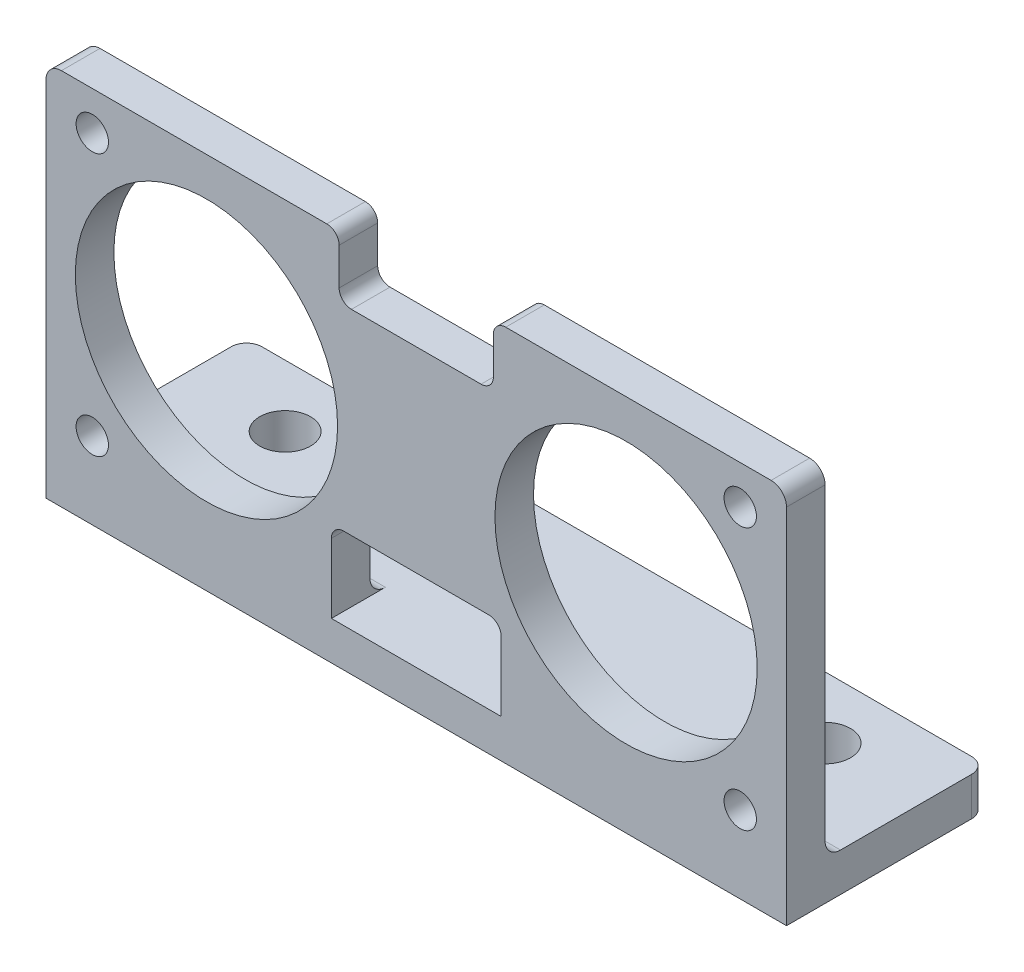
ISO-10303-21;
HEADER;
FILE_DESCRIPTION(('STEP AP214'),'2;1');
FILE_NAME('part.step','',(''),(''),'','','');
FILE_SCHEMA(('AUTOMOTIVE_DESIGN { 1 0 10303 214 1 1 1 1 }'));
ENDSEC;
DATA;
#1=APPLICATION_CONTEXT('core data for automotive mechanical design processes');
#2=APPLICATION_PROTOCOL_DEFINITION('international standard','automotive_design',2000,#1);
#3=PRODUCT_CONTEXT('',#1,'mechanical');
#4=PRODUCT('Part','Part','',(#3));
#5=PRODUCT_RELATED_PRODUCT_CATEGORY('part','',(#4));
#6=PRODUCT_DEFINITION_FORMATION('','',#4);
#7=PRODUCT_DEFINITION_CONTEXT('part definition',#1,'design');
#8=PRODUCT_DEFINITION('design','',#6,#7);
#9=PRODUCT_DEFINITION_SHAPE('','',#8);
#10=(LENGTH_UNIT() NAMED_UNIT(*) SI_UNIT(.MILLI.,.METRE.));
#11=(NAMED_UNIT(*) PLANE_ANGLE_UNIT() SI_UNIT($,.RADIAN.));
#12=(NAMED_UNIT(*) SI_UNIT($,.STERADIAN.) SOLID_ANGLE_UNIT());
#13=UNCERTAINTY_MEASURE_WITH_UNIT(LENGTH_MEASURE(1.E-05),#10,'distance_accuracy_value','');
#14=(GEOMETRIC_REPRESENTATION_CONTEXT(3) GLOBAL_UNCERTAINTY_ASSIGNED_CONTEXT((#13)) GLOBAL_UNIT_ASSIGNED_CONTEXT((#10,
#11,#12)) REPRESENTATION_CONTEXT('',''));
#15=CARTESIAN_POINT('',(0.,0.,0.));
#16=DIRECTION('',(0.,0.,1.));
#17=DIRECTION('',(1.,0.,0.));
#18=AXIS2_PLACEMENT_3D('',#15,#16,#17);
#19=CARTESIAN_POINT('',(5.,0.,2.5));
#20=DIRECTION('',(-1.,0.,0.));
#21=DIRECTION('',(0.,0.,1.));
#22=AXIS2_PLACEMENT_3D('',#19,#20,#21);
#23=PLANE('',#22);
#24=DIRECTION('',(0.,1.,0.));
#25=VECTOR('',#24,1.);
#26=CARTESIAN_POINT('',(5.,0.,2.5));
#27=LINE('',#26,#25);
#28=CARTESIAN_POINT('',(5.,7.8,2.5));
#29=VERTEX_POINT('',#28);
#30=CARTESIAN_POINT('',(5.,10.2,2.5));
#31=VERTEX_POINT('',#30);
#32=EDGE_CURVE('E285',#29,#31,#27,.T.);
#33=ORIENTED_EDGE('',*,*,#32,.T.);
#34=DIRECTION('',(0.,0.,-1.));
#35=VECTOR('',#34,1.);
#36=CARTESIAN_POINT('',(5.,10.2,2.5));
#37=LINE('',#36,#35);
#38=CARTESIAN_POINT('',(5.,10.2,0.));
#39=VERTEX_POINT('',#38);
#40=EDGE_CURVE('E364',#31,#39,#37,.T.);
#41=ORIENTED_EDGE('',*,*,#40,.T.);
#42=DIRECTION('',(0.,1.,0.));
#43=VECTOR('',#42,1.);
#44=CARTESIAN_POINT('',(5.,0.,0.));
#45=LINE('',#44,#43);
#46=CARTESIAN_POINT('',(5.,7.8,0.));
#47=VERTEX_POINT('',#46);
#48=EDGE_CURVE('E317',#47,#39,#45,.T.);
#49=ORIENTED_EDGE('',*,*,#48,.F.);
#50=DIRECTION('',(0.,0.,-1.));
#51=VECTOR('',#50,1.);
#52=CARTESIAN_POINT('',(5.,7.8,2.5));
#53=LINE('',#52,#51);
#54=EDGE_CURVE('E362',#47,#29,#53,.F.);
#55=ORIENTED_EDGE('',*,*,#54,.T.);
#56=EDGE_LOOP('',(#33,#41,#49,#55));
#57=FACE_BOUND('',#56,.T.);
#58=ADVANCED_FACE('F45',(#57),#23,.T.);
#59=CARTESIAN_POINT('',(0.,7.,2.5));
#60=DIRECTION('',(0.,1.,0.));
#61=DIRECTION('',(0.,0.,1.));
#62=AXIS2_PLACEMENT_3D('',#59,#60,#61);
#63=PLANE('',#62);
#64=DIRECTION('',(1.,0.,0.));
#65=VECTOR('',#64,1.);
#66=CARTESIAN_POINT('',(0.,7.,2.5));
#67=LINE('',#66,#65);
#68=CARTESIAN_POINT('',(-4.2,7.,2.5));
#69=VERTEX_POINT('',#68);
#70=CARTESIAN_POINT('',(4.2,7.,2.5));
#71=VERTEX_POINT('',#70);
#72=EDGE_CURVE('E288',#69,#71,#67,.T.);
#73=ORIENTED_EDGE('',*,*,#72,.T.);
#74=DIRECTION('',(0.,0.,-1.));
#75=VECTOR('',#74,1.);
#76=CARTESIAN_POINT('',(4.2,7.,0.));
#77=LINE('',#76,#75);
#78=CARTESIAN_POINT('',(4.2,7.,0.));
#79=VERTEX_POINT('',#78);
#80=EDGE_CURVE('E371',#71,#79,#77,.T.);
#81=ORIENTED_EDGE('',*,*,#80,.T.);
#82=DIRECTION('',(1.,0.,0.));
#83=VECTOR('',#82,1.);
#84=CARTESIAN_POINT('',(0.,7.,0.));
#85=LINE('',#84,#83);
#86=CARTESIAN_POINT('',(-4.2,7.,0.));
#87=VERTEX_POINT('',#86);
#88=EDGE_CURVE('E320',#87,#79,#85,.T.);
#89=ORIENTED_EDGE('',*,*,#88,.F.);
#90=DIRECTION('',(0.,0.,-1.));
#91=VECTOR('',#90,1.);
#92=CARTESIAN_POINT('',(-4.2,7.,2.5));
#93=LINE('',#92,#91);
#94=EDGE_CURVE('E369',#87,#69,#93,.F.);
#95=ORIENTED_EDGE('',*,*,#94,.T.);
#96=EDGE_LOOP('',(#73,#81,#89,#95));
#97=FACE_BOUND('',#96,.T.);
#98=ADVANCED_FACE('F545',(#97),#63,.T.);
#99=CARTESIAN_POINT('',(-5.,0.,2.5));
#100=DIRECTION('',(-1.,0.,0.));
#101=DIRECTION('',(0.,0.,1.));
#102=AXIS2_PLACEMENT_3D('',#99,#100,#101);
#103=PLANE('',#102);
#104=DIRECTION('',(0.,1.,0.));
#105=VECTOR('',#104,1.);
#106=CARTESIAN_POINT('',(-5.,0.,0.));
#107=LINE('',#106,#105);
#108=CARTESIAN_POINT('',(-5.,7.8,0.));
#109=VERTEX_POINT('',#108);
#110=CARTESIAN_POINT('',(-5.,10.2,0.));
#111=VERTEX_POINT('',#110);
#112=EDGE_CURVE('E323',#109,#111,#107,.T.);
#113=ORIENTED_EDGE('',*,*,#112,.T.);
#114=DIRECTION('',(0.,0.,-1.));
#115=VECTOR('',#114,1.);
#116=CARTESIAN_POINT('',(-5.,10.2,2.5));
#117=LINE('',#116,#115);
#118=CARTESIAN_POINT('',(-5.,10.2,2.5));
#119=VERTEX_POINT('',#118);
#120=EDGE_CURVE('E355',#111,#119,#117,.F.);
#121=ORIENTED_EDGE('',*,*,#120,.T.);
#122=DIRECTION('',(0.,1.,0.));
#123=VECTOR('',#122,1.);
#124=CARTESIAN_POINT('',(-5.,0.,2.5));
#125=LINE('',#124,#123);
#126=CARTESIAN_POINT('',(-5.,7.8,2.5));
#127=VERTEX_POINT('',#126);
#128=EDGE_CURVE('E291',#127,#119,#125,.T.);
#129=ORIENTED_EDGE('',*,*,#128,.F.);
#130=DIRECTION('',(0.,0.,-1.));
#131=VECTOR('',#130,1.);
#132=CARTESIAN_POINT('',(-5.,7.8,2.5));
#133=LINE('',#132,#131);
#134=EDGE_CURVE('E352',#127,#109,#133,.T.);
#135=ORIENTED_EDGE('',*,*,#134,.T.);
#136=EDGE_LOOP('',(#113,#121,#129,#135));
#137=FACE_BOUND('',#136,.T.);
#138=ADVANCED_FACE('F551',(#137),#103,.F.);
#139=CARTESIAN_POINT('',(0.,11.,2.5));
#140=DIRECTION('',(0.,1.,0.));
#141=DIRECTION('',(0.,0.,1.));
#142=AXIS2_PLACEMENT_3D('',#139,#140,#141);
#143=PLANE('',#142);
#144=DIRECTION('',(1.,0.,0.));
#145=VECTOR('',#144,1.);
#146=CARTESIAN_POINT('',(0.,11.,0.));
#147=LINE('',#146,#145);
#148=CARTESIAN_POINT('',(-23.,11.,0.));
#149=VERTEX_POINT('',#148);
#150=CARTESIAN_POINT('',(-5.8,11.,0.));
#151=VERTEX_POINT('',#150);
#152=EDGE_CURVE('E326',#149,#151,#147,.T.);
#153=ORIENTED_EDGE('',*,*,#152,.F.);
#154=DIRECTION('',(0.,0.,-1.));
#155=VECTOR('',#154,1.);
#156=CARTESIAN_POINT('',(-23.,11.,2.5));
#157=LINE('',#156,#155);
#158=CARTESIAN_POINT('',(-23.,11.,2.5));
#159=VERTEX_POINT('',#158);
#160=EDGE_CURVE('E11',#149,#159,#157,.F.);
#161=ORIENTED_EDGE('',*,*,#160,.T.);
#162=DIRECTION('',(1.,0.,0.));
#163=VECTOR('',#162,1.);
#164=CARTESIAN_POINT('',(0.,11.,2.5));
#165=LINE('',#164,#163);
#166=CARTESIAN_POINT('',(-5.8,11.,2.5));
#167=VERTEX_POINT('',#166);
#168=EDGE_CURVE('E294',#159,#167,#165,.T.);
#169=ORIENTED_EDGE('',*,*,#168,.T.);
#170=DIRECTION('',(0.,0.,-1.));
#171=VECTOR('',#170,1.);
#172=CARTESIAN_POINT('',(-5.8,11.,0.));
#173=LINE('',#172,#171);
#174=EDGE_CURVE('E345',#167,#151,#173,.T.);
#175=ORIENTED_EDGE('',*,*,#174,.T.);
#176=EDGE_LOOP('',(#153,#161,#169,#175));
#177=FACE_BOUND('',#176,.T.);
#178=ADVANCED_FACE('F620',(#177),#143,.T.);
#179=CARTESIAN_POINT('',(-24.,0.,2.5));
#180=DIRECTION('',(-1.,0.,0.));
#181=DIRECTION('',(0.,0.,1.));
#182=AXIS2_PLACEMENT_3D('',#179,#180,#181);
#183=PLANE('',#182);
#184=DIRECTION('',(0.,0.,-1.));
#185=VECTOR('',#184,1.);
#186=CARTESIAN_POINT('',(-24.,-11.,2.5));
#187=LINE('',#186,#185);
#188=CARTESIAN_POINT('',(-24.,-11.,-0.999999999999999));
#189=VERTEX_POINT('',#188);
#190=CARTESIAN_POINT('',(-24.,-11.,-9.49999999999999));
#191=VERTEX_POINT('',#190);
#192=EDGE_CURVE('E253',#189,#191,#187,.T.);
#193=ORIENTED_EDGE('',*,*,#192,.T.);
#194=DIRECTION('',(0.,1.,0.));
#195=VECTOR('',#194,1.);
#196=CARTESIAN_POINT('',(-24.,-13.5,-9.5));
#197=LINE('',#196,#195);
#198=CARTESIAN_POINT('',(-24.,-13.5,-9.49999999999999));
#199=VERTEX_POINT('',#198);
#200=EDGE_CURVE('E437',#191,#199,#197,.F.);
#201=ORIENTED_EDGE('',*,*,#200,.T.);
#202=DIRECTION('',(0.,0.,-1.));
#203=VECTOR('',#202,1.);
#204=CARTESIAN_POINT('',(-24.,-13.5,2.5));
#205=LINE('',#204,#203);
#206=CARTESIAN_POINT('',(-24.,-13.5,2.5));
#207=VERTEX_POINT('',#206);
#208=EDGE_CURVE('E265',#207,#199,#205,.T.);
#209=ORIENTED_EDGE('',*,*,#208,.F.);
#210=DIRECTION('',(0.,1.,0.));
#211=VECTOR('',#210,1.);
#212=CARTESIAN_POINT('',(-24.,0.,2.5));
#213=LINE('',#212,#211);
#214=CARTESIAN_POINT('',(-24.,9.99999999999999,2.5));
#215=VERTEX_POINT('',#214);
#216=EDGE_CURVE('E245',#207,#215,#213,.T.);
#217=ORIENTED_EDGE('',*,*,#216,.T.);
#218=DIRECTION('',(0.,0.,-1.));
#219=VECTOR('',#218,1.);
#220=CARTESIAN_POINT('',(-24.,9.99999999999999,2.5));
#221=LINE('',#220,#219);
#222=CARTESIAN_POINT('',(-24.,9.99999999999999,0.));
#223=VERTEX_POINT('',#222);
#224=EDGE_CURVE('E434',#215,#223,#221,.T.);
#225=ORIENTED_EDGE('',*,*,#224,.T.);
#226=DIRECTION('',(0.,1.,0.));
#227=VECTOR('',#226,1.);
#228=CARTESIAN_POINT('',(-24.,0.,0.));
#229=LINE('',#228,#227);
#230=CARTESIAN_POINT('',(-24.,-10.,0.));
#231=VERTEX_POINT('',#230);
#232=EDGE_CURVE('E328',#231,#223,#229,.T.);
#233=ORIENTED_EDGE('',*,*,#232,.F.);
#234=CARTESIAN_POINT('',(-24.,-10.,-1.));
#235=DIRECTION('',(-1.,0.,0.));
#236=DIRECTION('',(0.,0.,1.));
#237=AXIS2_PLACEMENT_3D('',#234,#235,#236);
#238=CIRCLE('',#237,1.);
#239=EDGE_CURVE('E412',#231,#189,#238,.F.);
#240=ORIENTED_EDGE('',*,*,#239,.T.);
#241=EDGE_LOOP('',(#193,#201,#209,#217,#225,#233,#240));
#242=FACE_BOUND('',#241,.T.);
#243=ADVANCED_FACE('F506',(#242),#183,.T.);
#244=CARTESIAN_POINT('',(-5.5,0.,2.5));
#245=DIRECTION('',(1.,0.,0.));
#246=DIRECTION('',(0.,1.,0.));
#247=AXIS2_PLACEMENT_3D('',#244,#245,#246);
#248=PLANE('',#247);
#249=DIRECTION('',(0.,-1.,0.));
#250=VECTOR('',#249,1.);
#251=CARTESIAN_POINT('',(-5.5,0.,0.));
#252=LINE('',#251,#250);
#253=CARTESIAN_POINT('',(-5.5,-6.5,0.));
#254=VERTEX_POINT('',#253);
#255=CARTESIAN_POINT('',(-5.5,-10.,0.));
#256=VERTEX_POINT('',#255);
#257=EDGE_CURVE('E330',#254,#256,#252,.T.);
#258=ORIENTED_EDGE('',*,*,#257,.F.);
#259=DIRECTION('',(0.,0.,-1.));
#260=VECTOR('',#259,1.);
#261=CARTESIAN_POINT('',(-5.5,-6.5,2.5));
#262=LINE('',#261,#260);
#263=CARTESIAN_POINT('',(-5.5,-6.5,2.5));
#264=VERTEX_POINT('',#263);
#265=EDGE_CURVE('E379',#254,#264,#262,.F.);
#266=ORIENTED_EDGE('',*,*,#265,.T.);
#267=DIRECTION('',(0.,-1.,0.));
#268=VECTOR('',#267,1.);
#269=CARTESIAN_POINT('',(-5.5,0.,2.5));
#270=LINE('',#269,#268);
#271=CARTESIAN_POINT('',(-5.5,-11.,2.5));
#272=VERTEX_POINT('',#271);
#273=EDGE_CURVE('E297',#264,#272,#270,.T.);
#274=ORIENTED_EDGE('',*,*,#273,.T.);
#275=DIRECTION('',(0.,0.,-1.));
#276=VECTOR('',#275,1.);
#277=CARTESIAN_POINT('',(-5.5,-11.,2.5));
#278=LINE('',#277,#276);
#279=CARTESIAN_POINT('',(-5.5,-11.,-1.));
#280=VERTEX_POINT('',#279);
#281=EDGE_CURVE('E343',#272,#280,#278,.T.);
#282=ORIENTED_EDGE('',*,*,#281,.T.);
#283=CARTESIAN_POINT('',(-5.5,-10.,-1.));
#284=DIRECTION('',(1.,0.,0.));
#285=DIRECTION('',(0.,1.,0.));
#286=AXIS2_PLACEMENT_3D('',#283,#284,#285);
#287=CIRCLE('',#286,1.);
#288=EDGE_CURVE('E410',#280,#256,#287,.F.);
#289=ORIENTED_EDGE('',*,*,#288,.T.);
#290=EDGE_LOOP('',(#258,#266,#274,#282,#289));
#291=FACE_BOUND('',#290,.T.);
#292=ADVANCED_FACE('F496',(#291),#248,.T.);
#293=CARTESIAN_POINT('',(0.,-5.7,2.5));
#294=DIRECTION('',(0.,1.,0.));
#295=DIRECTION('',(0.,0.,1.));
#296=AXIS2_PLACEMENT_3D('',#293,#294,#295);
#297=PLANE('',#296);
#298=DIRECTION('',(1.,0.,0.));
#299=VECTOR('',#298,1.);
#300=CARTESIAN_POINT('',(0.,-5.7,2.5));
#301=LINE('',#300,#299);
#302=CARTESIAN_POINT('',(-4.7,-5.7,2.5));
#303=VERTEX_POINT('',#302);
#304=CARTESIAN_POINT('',(4.7,-5.7,2.5));
#305=VERTEX_POINT('',#304);
#306=EDGE_CURVE('E299',#303,#305,#301,.T.);
#307=ORIENTED_EDGE('',*,*,#306,.F.);
#308=DIRECTION('',(0.,0.,-1.));
#309=VECTOR('',#308,1.);
#310=CARTESIAN_POINT('',(-4.7,-5.7,2.5));
#311=LINE('',#310,#309);
#312=CARTESIAN_POINT('',(-4.7,-5.7,0.));
#313=VERTEX_POINT('',#312);
#314=EDGE_CURVE('E376',#303,#313,#311,.T.);
#315=ORIENTED_EDGE('',*,*,#314,.T.);
#316=DIRECTION('',(1.,0.,0.));
#317=VECTOR('',#316,1.);
#318=CARTESIAN_POINT('',(0.,-5.7,0.));
#319=LINE('',#318,#317);
#320=CARTESIAN_POINT('',(4.7,-5.7,0.));
#321=VERTEX_POINT('',#320);
#322=EDGE_CURVE('E333',#313,#321,#319,.T.);
#323=ORIENTED_EDGE('',*,*,#322,.T.);
#324=DIRECTION('',(0.,0.,-1.));
#325=VECTOR('',#324,1.);
#326=CARTESIAN_POINT('',(4.7,-5.7,2.5));
#327=LINE('',#326,#325);
#328=EDGE_CURVE('E374',#321,#305,#327,.F.);
#329=ORIENTED_EDGE('',*,*,#328,.T.);
#330=EDGE_LOOP('',(#307,#315,#323,#329));
#331=FACE_BOUND('',#330,.T.);
#332=ADVANCED_FACE('F482',(#331),#297,.F.);
#333=CARTESIAN_POINT('',(5.5,0.,2.5));
#334=DIRECTION('',(1.,0.,0.));
#335=DIRECTION('',(0.,1.,0.));
#336=AXIS2_PLACEMENT_3D('',#333,#334,#335);
#337=PLANE('',#336);
#338=DIRECTION('',(0.,-1.,0.));
#339=VECTOR('',#338,1.);
#340=CARTESIAN_POINT('',(5.5,0.,2.5));
#341=LINE('',#340,#339);
#342=CARTESIAN_POINT('',(5.5,-6.5,2.5));
#343=VERTEX_POINT('',#342);
#344=CARTESIAN_POINT('',(5.5,-11.,2.5));
#345=VERTEX_POINT('',#344);
#346=EDGE_CURVE('E241',#343,#345,#341,.T.);
#347=ORIENTED_EDGE('',*,*,#346,.F.);
#348=DIRECTION('',(0.,0.,-1.));
#349=VECTOR('',#348,1.);
#350=CARTESIAN_POINT('',(5.5,-6.5,0.));
#351=LINE('',#350,#349);
#352=CARTESIAN_POINT('',(5.5,-6.5,0.));
#353=VERTEX_POINT('',#352);
#354=EDGE_CURVE('E381',#343,#353,#351,.T.);
#355=ORIENTED_EDGE('',*,*,#354,.T.);
#356=DIRECTION('',(0.,-1.,0.));
#357=VECTOR('',#356,1.);
#358=CARTESIAN_POINT('',(5.5,0.,0.));
#359=LINE('',#358,#357);
#360=CARTESIAN_POINT('',(5.5,-10.,0.));
#361=VERTEX_POINT('',#360);
#362=EDGE_CURVE('E336',#353,#361,#359,.T.);
#363=ORIENTED_EDGE('',*,*,#362,.T.);
#364=CARTESIAN_POINT('',(5.5,-10.,-1.));
#365=DIRECTION('',(1.,0.,0.));
#366=DIRECTION('',(0.,1.,0.));
#367=AXIS2_PLACEMENT_3D('',#364,#365,#366);
#368=CIRCLE('',#367,1.);
#369=CARTESIAN_POINT('',(5.5,-11.,-1.));
#370=VERTEX_POINT('',#369);
#371=EDGE_CURVE('E416',#361,#370,#368,.T.);
#372=ORIENTED_EDGE('',*,*,#371,.T.);
#373=DIRECTION('',(0.,0.,-1.));
#374=VECTOR('',#373,1.);
#375=CARTESIAN_POINT('',(5.5,-11.,2.5));
#376=LINE('',#375,#374);
#377=EDGE_CURVE('E341',#345,#370,#376,.T.);
#378=ORIENTED_EDGE('',*,*,#377,.F.);
#379=EDGE_LOOP('',(#347,#355,#363,#372,#378));
#380=FACE_BOUND('',#379,.T.);
#381=ADVANCED_FACE('F474',(#380),#337,.F.);
#382=CARTESIAN_POINT('',(24.,0.,2.5));
#383=DIRECTION('',(-1.,0.,0.));
#384=DIRECTION('',(0.,0.,1.));
#385=AXIS2_PLACEMENT_3D('',#382,#383,#384);
#386=PLANE('',#385);
#387=DIRECTION('',(0.,0.,1.));
#388=VECTOR('',#387,1.);
#389=CARTESIAN_POINT('',(24.,-13.5,2.50000000000001));
#390=LINE('',#389,#388);
#391=CARTESIAN_POINT('',(24.,-13.5,-9.49999999999999));
#392=VERTEX_POINT('',#391);
#393=CARTESIAN_POINT('',(24.,-13.5,2.50000000000001));
#394=VERTEX_POINT('',#393);
#395=EDGE_CURVE('E216',#392,#394,#390,.T.);
#396=ORIENTED_EDGE('',*,*,#395,.F.);
#397=DIRECTION('',(0.,1.,0.));
#398=VECTOR('',#397,1.);
#399=CARTESIAN_POINT('',(24.,0.,-9.49999999999999));
#400=LINE('',#399,#398);
#401=CARTESIAN_POINT('',(24.,-11.,-9.49999999999999));
#402=VERTEX_POINT('',#401);
#403=EDGE_CURVE('E420',#392,#402,#400,.T.);
#404=ORIENTED_EDGE('',*,*,#403,.T.);
#405=DIRECTION('',(0.,0.,1.));
#406=VECTOR('',#405,1.);
#407=CARTESIAN_POINT('',(24.,-11.,2.50000000000001));
#408=LINE('',#407,#406);
#409=CARTESIAN_POINT('',(24.,-11.,-0.999999999999999));
#410=VERTEX_POINT('',#409);
#411=EDGE_CURVE('E260',#402,#410,#408,.T.);
#412=ORIENTED_EDGE('',*,*,#411,.T.);
#413=CARTESIAN_POINT('',(24.,-10.,-1.));
#414=DIRECTION('',(-1.,0.,0.));
#415=DIRECTION('',(0.,0.,1.));
#416=AXIS2_PLACEMENT_3D('',#413,#414,#415);
#417=CIRCLE('',#416,1.);
#418=CARTESIAN_POINT('',(24.,-10.,0.));
#419=VERTEX_POINT('',#418);
#420=EDGE_CURVE('E414',#410,#419,#417,.T.);
#421=ORIENTED_EDGE('',*,*,#420,.T.);
#422=DIRECTION('',(0.,1.,0.));
#423=VECTOR('',#422,1.);
#424=CARTESIAN_POINT('',(24.,0.,0.));
#425=LINE('',#424,#423);
#426=CARTESIAN_POINT('',(24.,9.99999999999999,0.));
#427=VERTEX_POINT('',#426);
#428=EDGE_CURVE('E339',#419,#427,#425,.T.);
#429=ORIENTED_EDGE('',*,*,#428,.T.);
#430=DIRECTION('',(0.,0.,-1.));
#431=VECTOR('',#430,1.);
#432=CARTESIAN_POINT('',(24.,9.99999999999999,2.5));
#433=LINE('',#432,#431);
#434=CARTESIAN_POINT('',(24.,9.99999999999999,2.5));
#435=VERTEX_POINT('',#434);
#436=EDGE_CURVE('E237',#427,#435,#433,.F.);
#437=ORIENTED_EDGE('',*,*,#436,.T.);
#438=DIRECTION('',(0.,1.,0.));
#439=VECTOR('',#438,1.);
#440=CARTESIAN_POINT('',(24.,0.,2.5));
#441=LINE('',#440,#439);
#442=EDGE_CURVE('E233',#394,#435,#441,.T.);
#443=ORIENTED_EDGE('',*,*,#442,.F.);
#444=EDGE_LOOP('',(#396,#404,#412,#421,#429,#437,#443));
#445=FACE_BOUND('',#444,.T.);
#446=ADVANCED_FACE('F234',(#445),#386,.F.);
#447=CARTESIAN_POINT('',(13.6,0.,2.5));
#448=DIRECTION('',(0.,0.,-1.));
#449=DIRECTION('',(-1.,0.,0.));
#450=AXIS2_PLACEMENT_3D('',#447,#448,#449);
#451=CYLINDRICAL_SURFACE('',#450,8.5);
#452=CARTESIAN_POINT('',(13.6,0.,2.5));
#453=DIRECTION('',(0.,0.,1.));
#454=DIRECTION('',(1.,0.,0.));
#455=AXIS2_PLACEMENT_3D('',#452,#453,#454);
#456=CIRCLE('',#455,8.5);
#457=CARTESIAN_POINT('',(22.1,0.,2.5));
#458=VERTEX_POINT('',#457);
#459=EDGE_CURVE('E282',#458,#458,#456,.T.);
#460=ORIENTED_EDGE('',*,*,#459,.T.);
#461=EDGE_LOOP('',(#460));
#462=FACE_BOUND('',#461,.T.);
#463=CARTESIAN_POINT('',(13.6,0.,0.));
#464=DIRECTION('',(0.,0.,1.));
#465=DIRECTION('',(1.,0.,0.));
#466=AXIS2_PLACEMENT_3D('',#463,#464,#465);
#467=CIRCLE('',#466,8.5);
#468=CARTESIAN_POINT('',(22.1,0.,0.));
#469=VERTEX_POINT('',#468);
#470=EDGE_CURVE('E314',#469,#469,#467,.T.);
#471=ORIENTED_EDGE('',*,*,#470,.F.);
#472=EDGE_LOOP('',(#471));
#473=FACE_BOUND('',#472,.T.);
#474=ADVANCED_FACE('F556',(#462,#473),#451,.F.);
#475=CARTESIAN_POINT('',(-13.6,0.,2.5));
#476=DIRECTION('',(0.,0.,-1.));
#477=DIRECTION('',(-1.,0.,0.));
#478=AXIS2_PLACEMENT_3D('',#475,#476,#477);
#479=CYLINDRICAL_SURFACE('',#478,8.5);
#480=CARTESIAN_POINT('',(-13.6,0.,2.5));
#481=DIRECTION('',(0.,0.,1.));
#482=DIRECTION('',(1.,0.,0.));
#483=AXIS2_PLACEMENT_3D('',#480,#481,#482);
#484=CIRCLE('',#483,8.5);
#485=CARTESIAN_POINT('',(-5.1,0.,2.5));
#486=VERTEX_POINT('',#485);
#487=EDGE_CURVE('E279',#486,#486,#484,.T.);
#488=ORIENTED_EDGE('',*,*,#487,.T.);
#489=EDGE_LOOP('',(#488));
#490=FACE_BOUND('',#489,.T.);
#491=CARTESIAN_POINT('',(-13.6,0.,0.));
#492=DIRECTION('',(0.,0.,1.));
#493=DIRECTION('',(1.,0.,0.));
#494=AXIS2_PLACEMENT_3D('',#491,#492,#493);
#495=CIRCLE('',#494,8.5);
#496=CARTESIAN_POINT('',(-5.1,0.,0.));
#497=VERTEX_POINT('',#496);
#498=EDGE_CURVE('E311',#497,#497,#495,.T.);
#499=ORIENTED_EDGE('',*,*,#498,.F.);
#500=EDGE_LOOP('',(#499));
#501=FACE_BOUND('',#500,.T.);
#502=ADVANCED_FACE('F559',(#490,#501),#479,.F.);
#503=CARTESIAN_POINT('',(-21.,8.5,2.5));
#504=DIRECTION('',(0.,0.,-1.));
#505=DIRECTION('',(-1.,0.,0.));
#506=AXIS2_PLACEMENT_3D('',#503,#504,#505);
#507=CYLINDRICAL_SURFACE('',#506,1.05);
#508=CARTESIAN_POINT('',(-21.,8.5,2.5));
#509=DIRECTION('',(0.,0.,1.));
#510=DIRECTION('',(1.,0.,0.));
#511=AXIS2_PLACEMENT_3D('',#508,#509,#510);
#512=CIRCLE('',#511,1.05);
#513=CARTESIAN_POINT('',(-19.95,8.5,2.5));
#514=VERTEX_POINT('',#513);
#515=EDGE_CURVE('E276',#514,#514,#512,.T.);
#516=ORIENTED_EDGE('',*,*,#515,.T.);
#517=EDGE_LOOP('',(#516));
#518=FACE_BOUND('',#517,.T.);
#519=CARTESIAN_POINT('',(-21.,8.5,0.));
#520=DIRECTION('',(0.,0.,1.));
#521=DIRECTION('',(1.,0.,0.));
#522=AXIS2_PLACEMENT_3D('',#519,#520,#521);
#523=CIRCLE('',#522,1.05);
#524=CARTESIAN_POINT('',(-19.95,8.5,0.));
#525=VERTEX_POINT('',#524);
#526=EDGE_CURVE('E308',#525,#525,#523,.T.);
#527=ORIENTED_EDGE('',*,*,#526,.F.);
#528=EDGE_LOOP('',(#527));
#529=FACE_BOUND('',#528,.T.);
#530=ADVANCED_FACE('F563',(#518,#529),#507,.F.);
#531=CARTESIAN_POINT('',(21.,8.5,2.5));
#532=DIRECTION('',(0.,0.,-1.));
#533=DIRECTION('',(-1.,0.,0.));
#534=AXIS2_PLACEMENT_3D('',#531,#532,#533);
#535=CYLINDRICAL_SURFACE('',#534,1.05);
#536=CARTESIAN_POINT('',(21.,8.5,2.5));
#537=DIRECTION('',(0.,0.,1.));
#538=DIRECTION('',(1.,0.,0.));
#539=AXIS2_PLACEMENT_3D('',#536,#537,#538);
#540=CIRCLE('',#539,1.05);
#541=CARTESIAN_POINT('',(22.05,8.5,2.5));
#542=VERTEX_POINT('',#541);
#543=EDGE_CURVE('E273',#542,#542,#540,.T.);
#544=ORIENTED_EDGE('',*,*,#543,.T.);
#545=EDGE_LOOP('',(#544));
#546=FACE_BOUND('',#545,.T.);
#547=CARTESIAN_POINT('',(21.,8.5,0.));
#548=DIRECTION('',(0.,0.,1.));
#549=DIRECTION('',(1.,0.,0.));
#550=AXIS2_PLACEMENT_3D('',#547,#548,#549);
#551=CIRCLE('',#550,1.05);
#552=CARTESIAN_POINT('',(22.05,8.5,0.));
#553=VERTEX_POINT('',#552);
#554=EDGE_CURVE('E305',#553,#553,#551,.T.);
#555=ORIENTED_EDGE('',*,*,#554,.F.);
#556=EDGE_LOOP('',(#555));
#557=FACE_BOUND('',#556,.T.);
#558=ADVANCED_FACE('F567',(#546,#557),#535,.F.);
#559=CARTESIAN_POINT('',(21.,-8.5,2.5));
#560=DIRECTION('',(0.,0.,-1.));
#561=DIRECTION('',(-1.,0.,0.));
#562=AXIS2_PLACEMENT_3D('',#559,#560,#561);
#563=CYLINDRICAL_SURFACE('',#562,1.05);
#564=CARTESIAN_POINT('',(21.,-8.5,2.5));
#565=DIRECTION('',(0.,0.,1.));
#566=DIRECTION('',(1.,0.,0.));
#567=AXIS2_PLACEMENT_3D('',#564,#565,#566);
#568=CIRCLE('',#567,1.05);
#569=CARTESIAN_POINT('',(22.05,-8.5,2.5));
#570=VERTEX_POINT('',#569);
#571=EDGE_CURVE('E269',#570,#570,#568,.T.);
#572=ORIENTED_EDGE('',*,*,#571,.T.);
#573=EDGE_LOOP('',(#572));
#574=FACE_BOUND('',#573,.T.);
#575=CARTESIAN_POINT('',(21.,-8.5,0.));
#576=DIRECTION('',(0.,0.,1.));
#577=DIRECTION('',(1.,0.,0.));
#578=AXIS2_PLACEMENT_3D('',#575,#576,#577);
#579=CIRCLE('',#578,1.05);
#580=CARTESIAN_POINT('',(22.05,-8.5,0.));
#581=VERTEX_POINT('',#580);
#582=EDGE_CURVE('E249',#581,#581,#579,.T.);
#583=ORIENTED_EDGE('',*,*,#582,.F.);
#584=EDGE_LOOP('',(#583));
#585=FACE_BOUND('',#584,.T.);
#586=ADVANCED_FACE('F571',(#574,#585),#563,.F.);
#587=CARTESIAN_POINT('',(-21.,-8.5,2.5));
#588=DIRECTION('',(0.,0.,-1.));
#589=DIRECTION('',(-1.,0.,0.));
#590=AXIS2_PLACEMENT_3D('',#587,#588,#589);
#591=CYLINDRICAL_SURFACE('',#590,1.05);
#592=CARTESIAN_POINT('',(-21.,-8.5,2.5));
#593=DIRECTION('',(0.,0.,1.));
#594=DIRECTION('',(1.,0.,0.));
#595=AXIS2_PLACEMENT_3D('',#592,#593,#594);
#596=CIRCLE('',#595,1.05);
#597=CARTESIAN_POINT('',(-19.95,-8.5,2.5));
#598=VERTEX_POINT('',#597);
#599=EDGE_CURVE('E266',#598,#598,#596,.T.);
#600=ORIENTED_EDGE('',*,*,#599,.T.);
#601=EDGE_LOOP('',(#600));
#602=FACE_BOUND('',#601,.T.);
#603=CARTESIAN_POINT('',(-21.,-8.5,0.));
#604=DIRECTION('',(0.,0.,1.));
#605=DIRECTION('',(1.,0.,0.));
#606=AXIS2_PLACEMENT_3D('',#603,#604,#605);
#607=CIRCLE('',#606,1.05);
#608=CARTESIAN_POINT('',(-19.95,-8.5,0.));
#609=VERTEX_POINT('',#608);
#610=EDGE_CURVE('E246',#609,#609,#607,.T.);
#611=ORIENTED_EDGE('',*,*,#610,.F.);
#612=EDGE_LOOP('',(#611));
#613=FACE_BOUND('',#612,.T.);
#614=ADVANCED_FACE('F575',(#602,#613),#591,.F.);
#615=CARTESIAN_POINT('',(5.8,11.,2.5));
#616=VERTEX_POINT('',#615);
#617=CARTESIAN_POINT('',(23.,11.,2.5));
#618=VERTEX_POINT('',#617);
#619=EDGE_CURVE('E240',#616,#618,#165,.T.);
#620=ORIENTED_EDGE('',*,*,#619,.T.);
#621=DIRECTION('',(0.,0.,-1.));
#622=VECTOR('',#621,1.);
#623=CARTESIAN_POINT('',(23.,11.,0.));
#624=LINE('',#623,#622);
#625=CARTESIAN_POINT('',(23.,11.,0.));
#626=VERTEX_POINT('',#625);
#627=EDGE_CURVE('E439',#618,#626,#624,.T.);
#628=ORIENTED_EDGE('',*,*,#627,.T.);
#629=CARTESIAN_POINT('',(5.8,11.,0.));
#630=VERTEX_POINT('',#629);
#631=EDGE_CURVE('E270',#630,#626,#147,.T.);
#632=ORIENTED_EDGE('',*,*,#631,.F.);
#633=DIRECTION('',(0.,0.,-1.));
#634=VECTOR('',#633,1.);
#635=CARTESIAN_POINT('',(5.8,11.,2.5));
#636=LINE('',#635,#634);
#637=EDGE_CURVE('E367',#630,#616,#636,.F.);
#638=ORIENTED_EDGE('',*,*,#637,.T.);
#639=EDGE_LOOP('',(#620,#628,#632,#638));
#640=FACE_BOUND('',#639,.T.);
#641=ADVANCED_FACE('F452',(#640),#143,.T.);
#642=CARTESIAN_POINT('',(0.,0.,2.5));
#643=DIRECTION('',(0.,0.,1.));
#644=DIRECTION('',(1.,0.,0.));
#645=AXIS2_PLACEMENT_3D('',#642,#643,#644);
#646=PLANE('',#645);
#647=DIRECTION('',(-1.,0.,0.));
#648=VECTOR('',#647,1.);
#649=CARTESIAN_POINT('',(-24.,-11.,2.5));
#650=LINE('',#649,#648);
#651=EDGE_CURVE('E262',#345,#272,#650,.T.);
#652=ORIENTED_EDGE('',*,*,#651,.T.);
#653=ORIENTED_EDGE('',*,*,#273,.F.);
#654=CARTESIAN_POINT('',(-4.7,-6.5,2.5));
#655=DIRECTION('',(0.,0.,1.));
#656=DIRECTION('',(1.,0.,0.));
#657=AXIS2_PLACEMENT_3D('',#654,#655,#656);
#658=CIRCLE('',#657,0.8);
#659=EDGE_CURVE('E394',#264,#303,#658,.F.);
#660=ORIENTED_EDGE('',*,*,#659,.T.);
#661=ORIENTED_EDGE('',*,*,#306,.T.);
#662=CARTESIAN_POINT('',(4.7,-6.5,2.5));
#663=DIRECTION('',(0.,0.,1.));
#664=DIRECTION('',(1.,0.,0.));
#665=AXIS2_PLACEMENT_3D('',#662,#663,#664);
#666=CIRCLE('',#665,0.8);
#667=EDGE_CURVE('E398',#305,#343,#666,.F.);
#668=ORIENTED_EDGE('',*,*,#667,.T.);
#669=ORIENTED_EDGE('',*,*,#346,.T.);
#670=EDGE_LOOP('',(#652,#653,#660,#661,#668,#669));
#671=FACE_BOUND('',#670,.T.);
#672=ORIENTED_EDGE('',*,*,#599,.F.);
#673=EDGE_LOOP('',(#672));
#674=FACE_BOUND('',#673,.T.);
#675=ORIENTED_EDGE('',*,*,#571,.F.);
#676=EDGE_LOOP('',(#675));
#677=FACE_BOUND('',#676,.T.);
#678=ORIENTED_EDGE('',*,*,#543,.F.);
#679=EDGE_LOOP('',(#678));
#680=FACE_BOUND('',#679,.T.);
#681=ORIENTED_EDGE('',*,*,#515,.F.);
#682=EDGE_LOOP('',(#681));
#683=FACE_BOUND('',#682,.T.);
#684=ORIENTED_EDGE('',*,*,#487,.F.);
#685=EDGE_LOOP('',(#684));
#686=FACE_BOUND('',#685,.T.);
#687=ORIENTED_EDGE('',*,*,#459,.F.);
#688=EDGE_LOOP('',(#687));
#689=FACE_BOUND('',#688,.T.);
#690=ORIENTED_EDGE('',*,*,#442,.T.);
#691=CARTESIAN_POINT('',(23.,9.99999999999999,2.5));
#692=DIRECTION('',(0.,0.,1.));
#693=DIRECTION('',(1.,0.,0.));
#694=AXIS2_PLACEMENT_3D('',#691,#692,#693);
#695=CIRCLE('',#694,1.);
#696=EDGE_CURVE('E53',#435,#618,#695,.T.);
#697=ORIENTED_EDGE('',*,*,#696,.T.);
#698=ORIENTED_EDGE('',*,*,#619,.F.);
#699=CARTESIAN_POINT('',(5.8,10.2,2.5));
#700=DIRECTION('',(0.,0.,1.));
#701=DIRECTION('',(1.,0.,0.));
#702=AXIS2_PLACEMENT_3D('',#699,#700,#701);
#703=CIRCLE('',#702,0.8);
#704=EDGE_CURVE('E357',#616,#31,#703,.T.);
#705=ORIENTED_EDGE('',*,*,#704,.T.);
#706=ORIENTED_EDGE('',*,*,#32,.F.);
#707=CARTESIAN_POINT('',(4.2,7.8,2.5));
#708=DIRECTION('',(0.,0.,1.));
#709=DIRECTION('',(1.,0.,0.));
#710=AXIS2_PLACEMENT_3D('',#707,#708,#709);
#711=CIRCLE('',#710,0.8);
#712=EDGE_CURVE('E386',#29,#71,#711,.F.);
#713=ORIENTED_EDGE('',*,*,#712,.T.);
#714=ORIENTED_EDGE('',*,*,#72,.F.);
#715=CARTESIAN_POINT('',(-4.2,7.8,2.5));
#716=DIRECTION('',(0.,0.,1.));
#717=DIRECTION('',(1.,0.,0.));
#718=AXIS2_PLACEMENT_3D('',#715,#716,#717);
#719=CIRCLE('',#718,0.8);
#720=EDGE_CURVE('E390',#69,#127,#719,.F.);
#721=ORIENTED_EDGE('',*,*,#720,.T.);
#722=ORIENTED_EDGE('',*,*,#128,.T.);
#723=CARTESIAN_POINT('',(-5.8,10.2,2.5));
#724=DIRECTION('',(0.,0.,1.));
#725=DIRECTION('',(1.,0.,0.));
#726=AXIS2_PLACEMENT_3D('',#723,#724,#725);
#727=CIRCLE('',#726,0.8);
#728=EDGE_CURVE('E359',#119,#167,#727,.T.);
#729=ORIENTED_EDGE('',*,*,#728,.T.);
#730=ORIENTED_EDGE('',*,*,#168,.F.);
#731=CARTESIAN_POINT('',(-23.,9.99999999999999,2.5));
#732=DIRECTION('',(0.,0.,1.));
#733=DIRECTION('',(1.,0.,0.));
#734=AXIS2_PLACEMENT_3D('',#731,#732,#733);
#735=CIRCLE('',#734,1.);
#736=EDGE_CURVE('E445',#159,#215,#735,.T.);
#737=ORIENTED_EDGE('',*,*,#736,.T.);
#738=ORIENTED_EDGE('',*,*,#216,.F.);
#739=DIRECTION('',(-1.,0.,0.));
#740=VECTOR('',#739,1.);
#741=CARTESIAN_POINT('',(-24.,-13.5,2.5));
#742=LINE('',#741,#740);
#743=EDGE_CURVE('E223',#394,#207,#742,.T.);
#744=ORIENTED_EDGE('',*,*,#743,.F.);
#745=EDGE_LOOP('',(#690,#697,#698,#705,#706,#713,#714,#721,#722,#729,#730,#737,#738,#744));
#746=FACE_BOUND('',#745,.T.);
#747=ADVANCED_FACE('F243',(#671,#674,#677,#680,#683,#686,#689,#746),#646,.T.);
#748=CARTESIAN_POINT('',(0.,0.,0.));
#749=DIRECTION('',(0.,0.,1.));
#750=DIRECTION('',(1.,0.,0.));
#751=AXIS2_PLACEMENT_3D('',#748,#749,#750);
#752=PLANE('',#751);
#753=ORIENTED_EDGE('',*,*,#610,.T.);
#754=EDGE_LOOP('',(#753));
#755=FACE_BOUND('',#754,.T.);
#756=ORIENTED_EDGE('',*,*,#582,.T.);
#757=EDGE_LOOP('',(#756));
#758=FACE_BOUND('',#757,.T.);
#759=ORIENTED_EDGE('',*,*,#554,.T.);
#760=EDGE_LOOP('',(#759));
#761=FACE_BOUND('',#760,.T.);
#762=ORIENTED_EDGE('',*,*,#526,.T.);
#763=EDGE_LOOP('',(#762));
#764=FACE_BOUND('',#763,.T.);
#765=ORIENTED_EDGE('',*,*,#498,.T.);
#766=EDGE_LOOP('',(#765));
#767=FACE_BOUND('',#766,.T.);
#768=ORIENTED_EDGE('',*,*,#470,.T.);
#769=EDGE_LOOP('',(#768));
#770=FACE_BOUND('',#769,.T.);
#771=ORIENTED_EDGE('',*,*,#631,.T.);
#772=CARTESIAN_POINT('',(23.,9.99999999999999,0.));
#773=DIRECTION('',(0.,0.,1.));
#774=DIRECTION('',(1.,0.,0.));
#775=AXIS2_PLACEMENT_3D('',#772,#773,#774);
#776=CIRCLE('',#775,1.);
#777=EDGE_CURVE('E443',#626,#427,#776,.F.);
#778=ORIENTED_EDGE('',*,*,#777,.T.);
#779=ORIENTED_EDGE('',*,*,#428,.F.);
#780=DIRECTION('',(1.,0.,0.));
#781=VECTOR('',#780,1.);
#782=CARTESIAN_POINT('',(5.5,-10.,0.));
#783=LINE('',#782,#781);
#784=EDGE_CURVE('E406',#419,#361,#783,.F.);
#785=ORIENTED_EDGE('',*,*,#784,.T.);
#786=ORIENTED_EDGE('',*,*,#362,.F.);
#787=CARTESIAN_POINT('',(4.7,-6.5,0.));
#788=DIRECTION('',(0.,0.,1.));
#789=DIRECTION('',(1.,0.,0.));
#790=AXIS2_PLACEMENT_3D('',#787,#788,#789);
#791=CIRCLE('',#790,0.8);
#792=EDGE_CURVE('E396',#353,#321,#791,.T.);
#793=ORIENTED_EDGE('',*,*,#792,.T.);
#794=ORIENTED_EDGE('',*,*,#322,.F.);
#795=CARTESIAN_POINT('',(-4.7,-6.5,0.));
#796=DIRECTION('',(0.,0.,1.));
#797=DIRECTION('',(1.,0.,0.));
#798=AXIS2_PLACEMENT_3D('',#795,#796,#797);
#799=CIRCLE('',#798,0.8);
#800=EDGE_CURVE('E392',#313,#254,#799,.T.);
#801=ORIENTED_EDGE('',*,*,#800,.T.);
#802=ORIENTED_EDGE('',*,*,#257,.T.);
#803=DIRECTION('',(1.,0.,0.));
#804=VECTOR('',#803,1.);
#805=CARTESIAN_POINT('',(-24.,-10.,0.));
#806=LINE('',#805,#804);
#807=EDGE_CURVE('E408',#256,#231,#806,.F.);
#808=ORIENTED_EDGE('',*,*,#807,.T.);
#809=ORIENTED_EDGE('',*,*,#232,.T.);
#810=CARTESIAN_POINT('',(-23.,9.99999999999999,0.));
#811=DIRECTION('',(0.,0.,1.));
#812=DIRECTION('',(1.,0.,0.));
#813=AXIS2_PLACEMENT_3D('',#810,#811,#812);
#814=CIRCLE('',#813,1.);
#815=EDGE_CURVE('E66',#223,#149,#814,.F.);
#816=ORIENTED_EDGE('',*,*,#815,.T.);
#817=ORIENTED_EDGE('',*,*,#152,.T.);
#818=CARTESIAN_POINT('',(-5.8,10.2,0.));
#819=DIRECTION('',(0.,0.,1.));
#820=DIRECTION('',(1.,0.,0.));
#821=AXIS2_PLACEMENT_3D('',#818,#819,#820);
#822=CIRCLE('',#821,0.8);
#823=EDGE_CURVE('E350',#151,#111,#822,.F.);
#824=ORIENTED_EDGE('',*,*,#823,.T.);
#825=ORIENTED_EDGE('',*,*,#112,.F.);
#826=CARTESIAN_POINT('',(-4.2,7.8,0.));
#827=DIRECTION('',(0.,0.,1.));
#828=DIRECTION('',(1.,0.,0.));
#829=AXIS2_PLACEMENT_3D('',#826,#827,#828);
#830=CIRCLE('',#829,0.8);
#831=EDGE_CURVE('E388',#109,#87,#830,.T.);
#832=ORIENTED_EDGE('',*,*,#831,.T.);
#833=ORIENTED_EDGE('',*,*,#88,.T.);
#834=CARTESIAN_POINT('',(4.2,7.8,0.));
#835=DIRECTION('',(0.,0.,1.));
#836=DIRECTION('',(1.,0.,0.));
#837=AXIS2_PLACEMENT_3D('',#834,#835,#836);
#838=CIRCLE('',#837,0.8);
#839=EDGE_CURVE('E384',#79,#47,#838,.T.);
#840=ORIENTED_EDGE('',*,*,#839,.T.);
#841=ORIENTED_EDGE('',*,*,#48,.T.);
#842=CARTESIAN_POINT('',(5.8,10.2,0.));
#843=DIRECTION('',(0.,0.,1.));
#844=DIRECTION('',(1.,0.,0.));
#845=AXIS2_PLACEMENT_3D('',#842,#843,#844);
#846=CIRCLE('',#845,0.8);
#847=EDGE_CURVE('E348',#39,#630,#846,.F.);
#848=ORIENTED_EDGE('',*,*,#847,.T.);
#849=EDGE_LOOP('',(#771,#778,#779,#785,#786,#793,#794,#801,#802,#808,#809,#816,#817,#824,#825,
#832,#833,#840,#841,#848));
#850=FACE_BOUND('',#849,.T.);
#851=ADVANCED_FACE('F458',(#755,#758,#761,#764,#767,#770,#850),#752,.F.);
#852=CARTESIAN_POINT('',(-5.8,10.2,2.5));
#853=DIRECTION('',(0.,0.,1.));
#854=DIRECTION('',(1.,0.,0.));
#855=AXIS2_PLACEMENT_3D('',#852,#853,#854);
#856=CYLINDRICAL_SURFACE('',#855,0.8);
#857=ORIENTED_EDGE('',*,*,#728,.F.);
#858=ORIENTED_EDGE('',*,*,#120,.F.);
#859=ORIENTED_EDGE('',*,*,#823,.F.);
#860=ORIENTED_EDGE('',*,*,#174,.F.);
#861=EDGE_LOOP('',(#857,#858,#859,#860));
#862=FACE_BOUND('',#861,.T.);
#863=ADVANCED_FACE('F580',(#862),#856,.T.);
#864=CARTESIAN_POINT('',(5.8,10.2,2.5));
#865=DIRECTION('',(0.,0.,-1.));
#866=DIRECTION('',(-1.,0.,0.));
#867=AXIS2_PLACEMENT_3D('',#864,#865,#866);
#868=CYLINDRICAL_SURFACE('',#867,0.8);
#869=ORIENTED_EDGE('',*,*,#704,.F.);
#870=ORIENTED_EDGE('',*,*,#637,.F.);
#871=ORIENTED_EDGE('',*,*,#847,.F.);
#872=ORIENTED_EDGE('',*,*,#40,.F.);
#873=EDGE_LOOP('',(#869,#870,#871,#872));
#874=FACE_BOUND('',#873,.T.);
#875=ADVANCED_FACE('F583',(#874),#868,.T.);
#876=CARTESIAN_POINT('',(4.2,7.8,2.5));
#877=DIRECTION('',(0.,0.,1.));
#878=DIRECTION('',(1.,0.,0.));
#879=AXIS2_PLACEMENT_3D('',#876,#877,#878);
#880=CYLINDRICAL_SURFACE('',#879,0.8);
#881=ORIENTED_EDGE('',*,*,#712,.F.);
#882=ORIENTED_EDGE('',*,*,#54,.F.);
#883=ORIENTED_EDGE('',*,*,#839,.F.);
#884=ORIENTED_EDGE('',*,*,#80,.F.);
#885=EDGE_LOOP('',(#881,#882,#883,#884));
#886=FACE_BOUND('',#885,.T.);
#887=ADVANCED_FACE('F587',(#886),#880,.F.);
#888=CARTESIAN_POINT('',(-4.2,7.8,2.5));
#889=DIRECTION('',(0.,0.,-1.));
#890=DIRECTION('',(-1.,0.,0.));
#891=AXIS2_PLACEMENT_3D('',#888,#889,#890);
#892=CYLINDRICAL_SURFACE('',#891,0.8);
#893=ORIENTED_EDGE('',*,*,#720,.F.);
#894=ORIENTED_EDGE('',*,*,#94,.F.);
#895=ORIENTED_EDGE('',*,*,#831,.F.);
#896=ORIENTED_EDGE('',*,*,#134,.F.);
#897=EDGE_LOOP('',(#893,#894,#895,#896));
#898=FACE_BOUND('',#897,.T.);
#899=ADVANCED_FACE('F591',(#898),#892,.F.);
#900=CARTESIAN_POINT('',(-4.7,-6.5,2.5));
#901=DIRECTION('',(0.,0.,-1.));
#902=DIRECTION('',(-1.,0.,0.));
#903=AXIS2_PLACEMENT_3D('',#900,#901,#902);
#904=CYLINDRICAL_SURFACE('',#903,0.8);
#905=ORIENTED_EDGE('',*,*,#659,.F.);
#906=ORIENTED_EDGE('',*,*,#265,.F.);
#907=ORIENTED_EDGE('',*,*,#800,.F.);
#908=ORIENTED_EDGE('',*,*,#314,.F.);
#909=EDGE_LOOP('',(#905,#906,#907,#908));
#910=FACE_BOUND('',#909,.T.);
#911=ADVANCED_FACE('F491',(#910),#904,.F.);
#912=CARTESIAN_POINT('',(4.7,-6.5,2.5));
#913=DIRECTION('',(0.,0.,1.));
#914=DIRECTION('',(1.,0.,0.));
#915=AXIS2_PLACEMENT_3D('',#912,#913,#914);
#916=CYLINDRICAL_SURFACE('',#915,0.8);
#917=ORIENTED_EDGE('',*,*,#667,.F.);
#918=ORIENTED_EDGE('',*,*,#328,.F.);
#919=ORIENTED_EDGE('',*,*,#792,.F.);
#920=ORIENTED_EDGE('',*,*,#354,.F.);
#921=EDGE_LOOP('',(#917,#918,#919,#920));
#922=FACE_BOUND('',#921,.T.);
#923=ADVANCED_FACE('F485',(#922),#916,.F.);
#924=CARTESIAN_POINT('',(0.,-11.,0.));
#925=DIRECTION('',(0.,-1.,0.));
#926=DIRECTION('',(0.,0.,-1.));
#927=AXIS2_PLACEMENT_3D('',#924,#925,#926);
#928=PLANE('',#927);
#929=ORIENTED_EDGE('',*,*,#411,.F.);
#930=CARTESIAN_POINT('',(23.,-11.,-9.49999999999999));
#931=DIRECTION('',(0.,-1.,0.));
#932=DIRECTION('',(0.,0.,-1.));
#933=AXIS2_PLACEMENT_3D('',#930,#931,#932);
#934=CIRCLE('',#933,1.);
#935=CARTESIAN_POINT('',(23.,-11.,-10.5));
#936=VERTEX_POINT('',#935);
#937=EDGE_CURVE('E424',#402,#936,#934,.F.);
#938=ORIENTED_EDGE('',*,*,#937,.T.);
#939=DIRECTION('',(1.,0.,0.));
#940=VECTOR('',#939,1.);
#941=CARTESIAN_POINT('',(-24.,-11.,-10.5));
#942=LINE('',#941,#940);
#943=CARTESIAN_POINT('',(-23.,-11.,-10.5));
#944=VERTEX_POINT('',#943);
#945=EDGE_CURVE('E256',#944,#936,#942,.T.);
#946=ORIENTED_EDGE('',*,*,#945,.F.);
#947=CARTESIAN_POINT('',(-23.,-11.,-9.5));
#948=DIRECTION('',(0.,-1.,0.));
#949=DIRECTION('',(0.,0.,-1.));
#950=AXIS2_PLACEMENT_3D('',#947,#948,#949);
#951=CIRCLE('',#950,1.);
#952=EDGE_CURVE('E422',#944,#191,#951,.F.);
#953=ORIENTED_EDGE('',*,*,#952,.T.);
#954=ORIENTED_EDGE('',*,*,#192,.F.);
#955=DIRECTION('',(1.,0.,0.));
#956=VECTOR('',#955,1.);
#957=CARTESIAN_POINT('',(-5.5,-11.,-1.));
#958=LINE('',#957,#956);
#959=EDGE_CURVE('E403',#189,#280,#958,.T.);
#960=ORIENTED_EDGE('',*,*,#959,.T.);
#961=ORIENTED_EDGE('',*,*,#281,.F.);
#962=ORIENTED_EDGE('',*,*,#651,.F.);
#963=ORIENTED_EDGE('',*,*,#377,.T.);
#964=DIRECTION('',(1.,0.,0.));
#965=VECTOR('',#964,1.);
#966=CARTESIAN_POINT('',(24.,-11.,-1.));
#967=LINE('',#966,#965);
#968=EDGE_CURVE('E400',#370,#410,#967,.T.);
#969=ORIENTED_EDGE('',*,*,#968,.T.);
#970=EDGE_LOOP('',(#929,#938,#946,#953,#954,#960,#961,#962,#963,#969));
#971=FACE_BOUND('',#970,.T.);
#972=CARTESIAN_POINT('',(-17.5,-11.,-6.5));
#973=DIRECTION('',(0.,-1.,0.));
#974=DIRECTION('',(0.,0.,-1.));
#975=AXIS2_PLACEMENT_3D('',#972,#973,#974);
#976=CIRCLE('',#975,1.65);
#977=CARTESIAN_POINT('',(-17.5,-11.,-8.15));
#978=VERTEX_POINT('',#977);
#979=EDGE_CURVE('E518',#978,#978,#976,.T.);
#980=ORIENTED_EDGE('',*,*,#979,.T.);
#981=EDGE_LOOP('',(#980));
#982=FACE_BOUND('',#981,.T.);
#983=CARTESIAN_POINT('',(17.5,-11.,-6.49999999999999));
#984=DIRECTION('',(0.,-1.,0.));
#985=DIRECTION('',(0.,0.,-1.));
#986=AXIS2_PLACEMENT_3D('',#983,#984,#985);
#987=CIRCLE('',#986,1.65);
#988=CARTESIAN_POINT('',(17.5,-11.,-8.14999999999999));
#989=VERTEX_POINT('',#988);
#990=EDGE_CURVE('E524',#989,#989,#987,.T.);
#991=ORIENTED_EDGE('',*,*,#990,.T.);
#992=EDGE_LOOP('',(#991));
#993=FACE_BOUND('',#992,.T.);
#994=ADVANCED_FACE('F467',(#971,#982,#993),#928,.F.);
#995=CARTESIAN_POINT('',(0.,-13.5,0.));
#996=DIRECTION('',(0.,-1.,0.));
#997=DIRECTION('',(0.,0.,-1.));
#998=AXIS2_PLACEMENT_3D('',#995,#996,#997);
#999=PLANE('',#998);
#1000=CARTESIAN_POINT('',(-17.5,-13.5,-6.5));
#1001=DIRECTION('',(0.,-1.,0.));
#1002=DIRECTION('',(0.,0.,-1.));
#1003=AXIS2_PLACEMENT_3D('',#1000,#1001,#1002);
#1004=CIRCLE('',#1003,1.65);
#1005=CARTESIAN_POINT('',(-17.5,-13.5,-8.15));
#1006=VERTEX_POINT('',#1005);
#1007=EDGE_CURVE('E257',#1006,#1006,#1004,.T.);
#1008=ORIENTED_EDGE('',*,*,#1007,.F.);
#1009=EDGE_LOOP('',(#1008));
#1010=FACE_BOUND('',#1009,.T.);
#1011=DIRECTION('',(1.,0.,0.));
#1012=VECTOR('',#1011,1.);
#1013=CARTESIAN_POINT('',(-24.,-13.5,-10.5));
#1014=LINE('',#1013,#1012);
#1015=CARTESIAN_POINT('',(-23.,-13.5,-10.5));
#1016=VERTEX_POINT('',#1015);
#1017=CARTESIAN_POINT('',(23.,-13.5,-10.5));
#1018=VERTEX_POINT('',#1017);
#1019=EDGE_CURVE('E230',#1016,#1018,#1014,.T.);
#1020=ORIENTED_EDGE('',*,*,#1019,.T.);
#1021=CARTESIAN_POINT('',(23.,-13.5,-9.49999999999999));
#1022=DIRECTION('',(0.,-1.,0.));
#1023=DIRECTION('',(0.,0.,-1.));
#1024=AXIS2_PLACEMENT_3D('',#1021,#1022,#1023);
#1025=CIRCLE('',#1024,1.);
#1026=EDGE_CURVE('E226',#1018,#392,#1025,.T.);
#1027=ORIENTED_EDGE('',*,*,#1026,.T.);
#1028=ORIENTED_EDGE('',*,*,#395,.T.);
#1029=ORIENTED_EDGE('',*,*,#743,.T.);
#1030=ORIENTED_EDGE('',*,*,#208,.T.);
#1031=CARTESIAN_POINT('',(-23.,-13.5,-9.5));
#1032=DIRECTION('',(0.,-1.,0.));
#1033=DIRECTION('',(0.,0.,-1.));
#1034=AXIS2_PLACEMENT_3D('',#1031,#1032,#1033);
#1035=CIRCLE('',#1034,1.);
#1036=EDGE_CURVE('E431',#199,#1016,#1035,.T.);
#1037=ORIENTED_EDGE('',*,*,#1036,.T.);
#1038=EDGE_LOOP('',(#1020,#1027,#1028,#1029,#1030,#1037));
#1039=FACE_BOUND('',#1038,.T.);
#1040=CARTESIAN_POINT('',(17.5,-13.5,-6.49999999999999));
#1041=DIRECTION('',(0.,-1.,0.));
#1042=DIRECTION('',(0.,0.,-1.));
#1043=AXIS2_PLACEMENT_3D('',#1040,#1041,#1042);
#1044=CIRCLE('',#1043,1.65);
#1045=CARTESIAN_POINT('',(17.5,-13.5,-8.14999999999999));
#1046=VERTEX_POINT('',#1045);
#1047=EDGE_CURVE('E521',#1046,#1046,#1044,.T.);
#1048=ORIENTED_EDGE('',*,*,#1047,.F.);
#1049=EDGE_LOOP('',(#1048));
#1050=FACE_BOUND('',#1049,.T.);
#1051=ADVANCED_FACE('F219',(#1010,#1039,#1050),#999,.T.);
#1052=CARTESIAN_POINT('',(-24.,-13.5,-10.5));
#1053=DIRECTION('',(0.,0.,1.));
#1054=DIRECTION('',(1.,0.,0.));
#1055=AXIS2_PLACEMENT_3D('',#1052,#1053,#1054);
#1056=PLANE('',#1055);
#1057=ORIENTED_EDGE('',*,*,#945,.T.);
#1058=DIRECTION('',(0.,1.,0.));
#1059=VECTOR('',#1058,1.);
#1060=CARTESIAN_POINT('',(23.,-13.5,-10.5));
#1061=LINE('',#1060,#1059);
#1062=EDGE_CURVE('E429',#936,#1018,#1061,.F.);
#1063=ORIENTED_EDGE('',*,*,#1062,.T.);
#1064=ORIENTED_EDGE('',*,*,#1019,.F.);
#1065=DIRECTION('',(0.,1.,0.));
#1066=VECTOR('',#1065,1.);
#1067=CARTESIAN_POINT('',(-23.,-11.,-10.5));
#1068=LINE('',#1067,#1066);
#1069=EDGE_CURVE('E426',#1016,#944,#1068,.T.);
#1070=ORIENTED_EDGE('',*,*,#1069,.T.);
#1071=EDGE_LOOP('',(#1057,#1063,#1064,#1070));
#1072=FACE_BOUND('',#1071,.T.);
#1073=ADVANCED_FACE('F514',(#1072),#1056,.F.);
#1074=CARTESIAN_POINT('',(-17.5,-13.5,-6.5));
#1075=DIRECTION('',(0.,1.,0.));
#1076=DIRECTION('',(0.,0.,1.));
#1077=AXIS2_PLACEMENT_3D('',#1074,#1075,#1076);
#1078=CYLINDRICAL_SURFACE('',#1077,1.65);
#1079=ORIENTED_EDGE('',*,*,#1007,.T.);
#1080=EDGE_LOOP('',(#1079));
#1081=FACE_BOUND('',#1080,.T.);
#1082=ORIENTED_EDGE('',*,*,#979,.F.);
#1083=EDGE_LOOP('',(#1082));
#1084=FACE_BOUND('',#1083,.T.);
#1085=ADVANCED_FACE('F539',(#1081,#1084),#1078,.F.);
#1086=CARTESIAN_POINT('',(17.5,-13.5,-6.49999999999999));
#1087=DIRECTION('',(0.,1.,0.));
#1088=DIRECTION('',(0.,0.,1.));
#1089=AXIS2_PLACEMENT_3D('',#1086,#1087,#1088);
#1090=CYLINDRICAL_SURFACE('',#1089,1.65);
#1091=ORIENTED_EDGE('',*,*,#1047,.T.);
#1092=EDGE_LOOP('',(#1091));
#1093=FACE_BOUND('',#1092,.T.);
#1094=ORIENTED_EDGE('',*,*,#990,.F.);
#1095=EDGE_LOOP('',(#1094));
#1096=FACE_BOUND('',#1095,.T.);
#1097=ADVANCED_FACE('F530',(#1093,#1096),#1090,.F.);
#1098=CARTESIAN_POINT('',(0.,-10.,-1.));
#1099=DIRECTION('',(-1.,0.,0.));
#1100=DIRECTION('',(0.,0.,1.));
#1101=AXIS2_PLACEMENT_3D('',#1098,#1099,#1100);
#1102=CYLINDRICAL_SURFACE('',#1101,1.);
#1103=ORIENTED_EDGE('',*,*,#239,.F.);
#1104=ORIENTED_EDGE('',*,*,#807,.F.);
#1105=ORIENTED_EDGE('',*,*,#288,.F.);
#1106=ORIENTED_EDGE('',*,*,#959,.F.);
#1107=EDGE_LOOP('',(#1103,#1104,#1105,#1106));
#1108=FACE_BOUND('',#1107,.T.);
#1109=ADVANCED_FACE('F501',(#1108),#1102,.F.);
#1110=CARTESIAN_POINT('',(0.,-10.,-1.));
#1111=DIRECTION('',(-1.,0.,0.));
#1112=DIRECTION('',(0.,0.,1.));
#1113=AXIS2_PLACEMENT_3D('',#1110,#1111,#1112);
#1114=CYLINDRICAL_SURFACE('',#1113,1.);
#1115=ORIENTED_EDGE('',*,*,#371,.F.);
#1116=ORIENTED_EDGE('',*,*,#784,.F.);
#1117=ORIENTED_EDGE('',*,*,#420,.F.);
#1118=ORIENTED_EDGE('',*,*,#968,.F.);
#1119=EDGE_LOOP('',(#1115,#1116,#1117,#1118));
#1120=FACE_BOUND('',#1119,.T.);
#1121=ADVANCED_FACE('F465',(#1120),#1114,.F.);
#1122=CARTESIAN_POINT('',(23.,0.,-9.49999999999999));
#1123=DIRECTION('',(0.,1.,0.));
#1124=DIRECTION('',(0.,0.,1.));
#1125=AXIS2_PLACEMENT_3D('',#1122,#1123,#1124);
#1126=CYLINDRICAL_SURFACE('',#1125,1.);
#1127=ORIENTED_EDGE('',*,*,#1026,.F.);
#1128=ORIENTED_EDGE('',*,*,#1062,.F.);
#1129=ORIENTED_EDGE('',*,*,#937,.F.);
#1130=ORIENTED_EDGE('',*,*,#403,.F.);
#1131=EDGE_LOOP('',(#1127,#1128,#1129,#1130));
#1132=FACE_BOUND('',#1131,.T.);
#1133=ADVANCED_FACE('F604',(#1132),#1126,.T.);
#1134=CARTESIAN_POINT('',(-23.,-13.5,-9.5));
#1135=DIRECTION('',(0.,-1.,0.));
#1136=DIRECTION('',(0.,0.,-1.));
#1137=AXIS2_PLACEMENT_3D('',#1134,#1135,#1136);
#1138=CYLINDRICAL_SURFACE('',#1137,1.);
#1139=ORIENTED_EDGE('',*,*,#1036,.F.);
#1140=ORIENTED_EDGE('',*,*,#200,.F.);
#1141=ORIENTED_EDGE('',*,*,#952,.F.);
#1142=ORIENTED_EDGE('',*,*,#1069,.F.);
#1143=EDGE_LOOP('',(#1139,#1140,#1141,#1142));
#1144=FACE_BOUND('',#1143,.T.);
#1145=ADVANCED_FACE('F510',(#1144),#1138,.T.);
#1146=CARTESIAN_POINT('',(23.,9.99999999999999,2.5));
#1147=DIRECTION('',(0.,0.,1.));
#1148=DIRECTION('',(1.,0.,0.));
#1149=AXIS2_PLACEMENT_3D('',#1146,#1147,#1148);
#1150=CYLINDRICAL_SURFACE('',#1149,1.);
#1151=ORIENTED_EDGE('',*,*,#696,.F.);
#1152=ORIENTED_EDGE('',*,*,#436,.F.);
#1153=ORIENTED_EDGE('',*,*,#777,.F.);
#1154=ORIENTED_EDGE('',*,*,#627,.F.);
#1155=EDGE_LOOP('',(#1151,#1152,#1153,#1154));
#1156=FACE_BOUND('',#1155,.T.);
#1157=ADVANCED_FACE('F456',(#1156),#1150,.T.);
#1158=CARTESIAN_POINT('',(-23.,9.99999999999999,2.5));
#1159=DIRECTION('',(0.,0.,-1.));
#1160=DIRECTION('',(-1.,0.,0.));
#1161=AXIS2_PLACEMENT_3D('',#1158,#1159,#1160);
#1162=CYLINDRICAL_SURFACE('',#1161,1.);
#1163=ORIENTED_EDGE('',*,*,#736,.F.);
#1164=ORIENTED_EDGE('',*,*,#160,.F.);
#1165=ORIENTED_EDGE('',*,*,#815,.F.);
#1166=ORIENTED_EDGE('',*,*,#224,.F.);
#1167=EDGE_LOOP('',(#1163,#1164,#1165,#1166));
#1168=FACE_BOUND('',#1167,.T.);
#1169=ADVANCED_FACE('F47',(#1168),#1162,.T.);
#1170=CLOSED_SHELL('',(#58,#98,#138,#178,#243,#292,#332,#381,#446,#474,#502,#530,#558,#586,#614,
#641,#747,#851,#863,#875,#887,#899,#911,#923,#994,#1051,#1073,#1085,#1097,#1109,#1121,#1133,
#1145,#1157,#1169));
#1171=MANIFOLD_SOLID_BREP('B2',#1170);
#1172=ADVANCED_BREP_SHAPE_REPRESENTATION('',(#18,#1171),#14);
#1173=SHAPE_DEFINITION_REPRESENTATION(#9,#1172);
ENDSEC;
END-ISO-10303-21;
